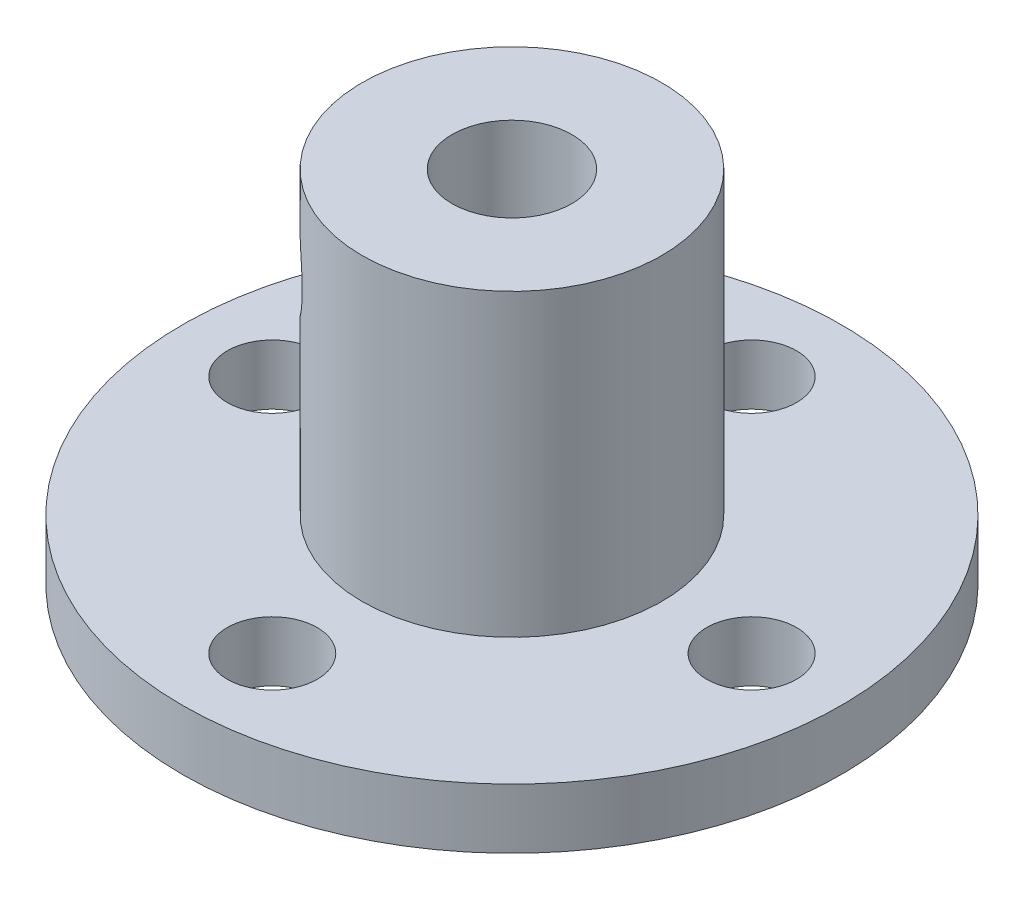
ISO-10303-21;
HEADER;
FILE_DESCRIPTION(('STEP AP214'),'2;1');
FILE_NAME('part.step','',(''),(''),'','','');
FILE_SCHEMA(('AUTOMOTIVE_DESIGN { 1 0 10303 214 1 1 1 1 }'));
ENDSEC;
DATA;
#1=APPLICATION_CONTEXT('core data for automotive mechanical design processes');
#2=APPLICATION_PROTOCOL_DEFINITION('international standard','automotive_design',2000,#1);
#3=PRODUCT_CONTEXT('',#1,'mechanical');
#4=PRODUCT('Part','Part','',(#3));
#5=PRODUCT_RELATED_PRODUCT_CATEGORY('part','',(#4));
#6=PRODUCT_DEFINITION_FORMATION('','',#4);
#7=PRODUCT_DEFINITION_CONTEXT('part definition',#1,'design');
#8=PRODUCT_DEFINITION('design','',#6,#7);
#9=PRODUCT_DEFINITION_SHAPE('','',#8);
#10=(LENGTH_UNIT() NAMED_UNIT(*) SI_UNIT(.MILLI.,.METRE.));
#11=(NAMED_UNIT(*) PLANE_ANGLE_UNIT() SI_UNIT($,.RADIAN.));
#12=(NAMED_UNIT(*) SI_UNIT($,.STERADIAN.) SOLID_ANGLE_UNIT());
#13=UNCERTAINTY_MEASURE_WITH_UNIT(LENGTH_MEASURE(1.E-05),#10,'distance_accuracy_value','');
#14=(GEOMETRIC_REPRESENTATION_CONTEXT(3) GLOBAL_UNCERTAINTY_ASSIGNED_CONTEXT((#13)) GLOBAL_UNIT_ASSIGNED_CONTEXT((#10,
#11,#12)) REPRESENTATION_CONTEXT('',''));
#15=CARTESIAN_POINT('',(0.,0.,0.));
#16=DIRECTION('',(0.,0.,1.));
#17=DIRECTION('',(1.,0.,0.));
#18=AXIS2_PLACEMENT_3D('',#15,#16,#17);
#19=CARTESIAN_POINT('',(8.00000000000023,2.,-2.25904099284255E-13));
#20=DIRECTION('',(0.,-1.,0.));
#21=DIRECTION('',(0.,0.,-1.));
#22=AXIS2_PLACEMENT_3D('',#19,#20,#21);
#23=CYLINDRICAL_SURFACE('',#22,1.50000000000018);
#24=CARTESIAN_POINT('',(8.00000000000023,2.,-2.25904099284255E-13));
#25=DIRECTION('',(0.,1.,0.));
#26=DIRECTION('',(0.,0.,1.));
#27=AXIS2_PLACEMENT_3D('',#24,#25,#26);
#28=CIRCLE('',#27,1.50000000000018);
#29=CARTESIAN_POINT('',(8.00000000000023,2.,1.49999999999995));
#30=VERTEX_POINT('',#29);
#31=EDGE_CURVE('E54',#30,#30,#28,.T.);
#32=ORIENTED_EDGE('',*,*,#31,.T.);
#33=EDGE_LOOP('',(#32));
#34=FACE_BOUND('',#33,.T.);
#35=CARTESIAN_POINT('',(8.00000000000023,0.,-2.25904099284255E-13));
#36=DIRECTION('',(0.,1.,0.));
#37=DIRECTION('',(0.,0.,1.));
#38=AXIS2_PLACEMENT_3D('',#35,#36,#37);
#39=CIRCLE('',#38,1.50000000000018);
#40=CARTESIAN_POINT('',(8.00000000000023,0.,1.49999999999995));
#41=VERTEX_POINT('',#40);
#42=EDGE_CURVE('E70',#41,#41,#39,.T.);
#43=ORIENTED_EDGE('',*,*,#42,.F.);
#44=EDGE_LOOP('',(#43));
#45=FACE_BOUND('',#44,.T.);
#46=ADVANCED_FACE('F39',(#34,#45),#23,.F.);
#47=CARTESIAN_POINT('',(4.51808198568511E-13,2.,8.));
#48=DIRECTION('',(0.,-1.,0.));
#49=DIRECTION('',(0.,0.,-1.));
#50=AXIS2_PLACEMENT_3D('',#47,#48,#49);
#51=CYLINDRICAL_SURFACE('',#50,1.50000000000049);
#52=CARTESIAN_POINT('',(4.51808198568511E-13,2.,8.));
#53=DIRECTION('',(0.,1.,0.));
#54=DIRECTION('',(0.,0.,1.));
#55=AXIS2_PLACEMENT_3D('',#52,#53,#54);
#56=CIRCLE('',#55,1.50000000000049);
#57=CARTESIAN_POINT('',(4.51808198568511E-13,2.,9.50000000000048));
#58=VERTEX_POINT('',#57);
#59=EDGE_CURVE('E88',#58,#58,#56,.T.);
#60=ORIENTED_EDGE('',*,*,#59,.T.);
#61=EDGE_LOOP('',(#60));
#62=FACE_BOUND('',#61,.T.);
#63=CARTESIAN_POINT('',(4.51808198568511E-13,0.,8.));
#64=DIRECTION('',(0.,1.,0.));
#65=DIRECTION('',(0.,0.,1.));
#66=AXIS2_PLACEMENT_3D('',#63,#64,#65);
#67=CIRCLE('',#66,1.50000000000049);
#68=CARTESIAN_POINT('',(4.51808198568511E-13,0.,9.50000000000048));
#69=VERTEX_POINT('',#68);
#70=EDGE_CURVE('E67',#69,#69,#67,.T.);
#71=ORIENTED_EDGE('',*,*,#70,.F.);
#72=EDGE_LOOP('',(#71));
#73=FACE_BOUND('',#72,.T.);
#74=ADVANCED_FACE('F159',(#62,#73),#51,.F.);
#75=CARTESIAN_POINT('',(-7.99999999999977,2.,2.26883816723573E-13));
#76=DIRECTION('',(0.,-1.,0.));
#77=DIRECTION('',(0.,0.,-1.));
#78=AXIS2_PLACEMENT_3D('',#75,#76,#77);
#79=CYLINDRICAL_SURFACE('',#78,1.50000000000036);
#80=CARTESIAN_POINT('',(-7.99999999999977,2.,2.26883816723573E-13));
#81=DIRECTION('',(0.,1.,0.));
#82=DIRECTION('',(0.,0.,1.));
#83=AXIS2_PLACEMENT_3D('',#80,#81,#82);
#84=CIRCLE('',#83,1.50000000000036);
#85=CARTESIAN_POINT('',(-7.99999999999977,2.,1.50000000000059));
#86=VERTEX_POINT('',#85);
#87=EDGE_CURVE('E82',#86,#86,#84,.T.);
#88=ORIENTED_EDGE('',*,*,#87,.T.);
#89=EDGE_LOOP('',(#88));
#90=FACE_BOUND('',#89,.T.);
#91=CARTESIAN_POINT('',(-7.99999999999977,0.,2.26883816723573E-13));
#92=DIRECTION('',(0.,1.,0.));
#93=DIRECTION('',(0.,0.,1.));
#94=AXIS2_PLACEMENT_3D('',#91,#92,#93);
#95=CIRCLE('',#94,1.50000000000036);
#96=CARTESIAN_POINT('',(-7.99999999999977,0.,1.50000000000059));
#97=VERTEX_POINT('',#96);
#98=EDGE_CURVE('E62',#97,#97,#95,.T.);
#99=ORIENTED_EDGE('',*,*,#98,.F.);
#100=EDGE_LOOP('',(#99));
#101=FACE_BOUND('',#100,.T.);
#102=ADVANCED_FACE('F164',(#90,#101),#79,.F.);
#103=CARTESIAN_POINT('',(0.,2.,-8.));
#104=DIRECTION('',(0.,-1.,0.));
#105=DIRECTION('',(0.,0.,-1.));
#106=AXIS2_PLACEMENT_3D('',#103,#104,#105);
#107=CYLINDRICAL_SURFACE('',#106,1.5);
#108=CARTESIAN_POINT('',(0.,2.,-8.));
#109=DIRECTION('',(0.,1.,0.));
#110=DIRECTION('',(0.,0.,1.));
#111=AXIS2_PLACEMENT_3D('',#108,#109,#110);
#112=CIRCLE('',#111,1.5);
#113=CARTESIAN_POINT('',(0.,2.,-6.5));
#114=VERTEX_POINT('',#113);
#115=EDGE_CURVE('E77',#114,#114,#112,.T.);
#116=ORIENTED_EDGE('',*,*,#115,.T.);
#117=EDGE_LOOP('',(#116));
#118=FACE_BOUND('',#117,.T.);
#119=CARTESIAN_POINT('',(0.,0.,-8.));
#120=DIRECTION('',(0.,1.,0.));
#121=DIRECTION('',(0.,0.,1.));
#122=AXIS2_PLACEMENT_3D('',#119,#120,#121);
#123=CIRCLE('',#122,1.5);
#124=CARTESIAN_POINT('',(0.,0.,-6.5));
#125=VERTEX_POINT('',#124);
#126=EDGE_CURVE('E58',#125,#125,#123,.T.);
#127=ORIENTED_EDGE('',*,*,#126,.F.);
#128=EDGE_LOOP('',(#127));
#129=FACE_BOUND('',#128,.T.);
#130=ADVANCED_FACE('F41',(#118,#129),#107,.F.);
#131=CARTESIAN_POINT('',(0.,2.,0.));
#132=DIRECTION('',(0.,-1.,0.));
#133=DIRECTION('',(0.,0.,-1.));
#134=AXIS2_PLACEMENT_3D('',#131,#132,#133);
#135=CYLINDRICAL_SURFACE('',#134,11.);
#136=CARTESIAN_POINT('',(0.,2.,0.));
#137=DIRECTION('',(0.,1.,0.));
#138=DIRECTION('',(0.,0.,1.));
#139=AXIS2_PLACEMENT_3D('',#136,#137,#138);
#140=CIRCLE('',#139,11.);
#141=CARTESIAN_POINT('',(0.,2.,11.));
#142=VERTEX_POINT('',#141);
#143=EDGE_CURVE('E10',#142,#142,#140,.T.);
#144=ORIENTED_EDGE('',*,*,#143,.F.);
#145=EDGE_LOOP('',(#144));
#146=FACE_BOUND('',#145,.T.);
#147=CARTESIAN_POINT('',(0.,0.,0.));
#148=DIRECTION('',(0.,1.,0.));
#149=DIRECTION('',(0.,0.,1.));
#150=AXIS2_PLACEMENT_3D('',#147,#148,#149);
#151=CIRCLE('',#150,11.);
#152=CARTESIAN_POINT('',(0.,0.,11.));
#153=VERTEX_POINT('',#152);
#154=EDGE_CURVE('E43',#153,#153,#151,.T.);
#155=ORIENTED_EDGE('',*,*,#154,.T.);
#156=EDGE_LOOP('',(#155));
#157=FACE_BOUND('',#156,.T.);
#158=ADVANCED_FACE('F106',(#146,#157),#135,.T.);
#159=CARTESIAN_POINT('',(0.,2.,0.));
#160=DIRECTION('',(0.,1.,0.));
#161=DIRECTION('',(0.,0.,1.));
#162=AXIS2_PLACEMENT_3D('',#159,#160,#161);
#163=PLANE('',#162);
#164=ORIENTED_EDGE('',*,*,#115,.F.);
#165=EDGE_LOOP('',(#164));
#166=FACE_BOUND('',#165,.T.);
#167=ORIENTED_EDGE('',*,*,#87,.F.);
#168=EDGE_LOOP('',(#167));
#169=FACE_BOUND('',#168,.T.);
#170=ORIENTED_EDGE('',*,*,#59,.F.);
#171=EDGE_LOOP('',(#170));
#172=FACE_BOUND('',#171,.T.);
#173=ORIENTED_EDGE('',*,*,#31,.F.);
#174=EDGE_LOOP('',(#173));
#175=FACE_BOUND('',#174,.T.);
#176=CARTESIAN_POINT('',(0.,2.,0.));
#177=DIRECTION('',(0.,1.,0.));
#178=DIRECTION('',(0.,0.,1.));
#179=AXIS2_PLACEMENT_3D('',#176,#177,#178);
#180=CIRCLE('',#179,5.);
#181=CARTESIAN_POINT('',(0.,2.,5.));
#182=VERTEX_POINT('',#181);
#183=EDGE_CURVE('E48',#182,#182,#180,.T.);
#184=ORIENTED_EDGE('',*,*,#183,.F.);
#185=EDGE_LOOP('',(#184));
#186=FACE_BOUND('',#185,.T.);
#187=ORIENTED_EDGE('',*,*,#143,.T.);
#188=EDGE_LOOP('',(#187));
#189=FACE_BOUND('',#188,.T.);
#190=ADVANCED_FACE('F102',(#166,#169,#172,#175,#186,#189),#163,.T.);
#191=CARTESIAN_POINT('',(0.,0.,0.));
#192=DIRECTION('',(0.,1.,0.));
#193=DIRECTION('',(0.,0.,1.));
#194=AXIS2_PLACEMENT_3D('',#191,#192,#193);
#195=PLANE('',#194);
#196=ORIENTED_EDGE('',*,*,#126,.T.);
#197=EDGE_LOOP('',(#196));
#198=FACE_BOUND('',#197,.T.);
#199=ORIENTED_EDGE('',*,*,#98,.T.);
#200=EDGE_LOOP('',(#199));
#201=FACE_BOUND('',#200,.T.);
#202=ORIENTED_EDGE('',*,*,#70,.T.);
#203=EDGE_LOOP('',(#202));
#204=FACE_BOUND('',#203,.T.);
#205=ORIENTED_EDGE('',*,*,#42,.T.);
#206=EDGE_LOOP('',(#205));
#207=FACE_BOUND('',#206,.T.);
#208=ORIENTED_EDGE('',*,*,#154,.F.);
#209=EDGE_LOOP('',(#208));
#210=FACE_BOUND('',#209,.T.);
#211=CARTESIAN_POINT('',(0.,0.,0.));
#212=DIRECTION('',(0.,1.,0.));
#213=DIRECTION('',(0.,0.,1.));
#214=AXIS2_PLACEMENT_3D('',#211,#212,#213);
#215=CIRCLE('',#214,2.);
#216=CARTESIAN_POINT('',(0.,0.,2.));
#217=VERTEX_POINT('',#216);
#218=EDGE_CURVE('E91',#217,#217,#215,.T.);
#219=ORIENTED_EDGE('',*,*,#218,.T.);
#220=EDGE_LOOP('',(#219));
#221=FACE_BOUND('',#220,.T.);
#222=ADVANCED_FACE('F105',(#198,#201,#204,#207,#210,#221),#195,.F.);
#223=CARTESIAN_POINT('',(0.,12.,0.));
#224=DIRECTION('',(0.,-1.,0.));
#225=DIRECTION('',(0.,0.,-1.));
#226=AXIS2_PLACEMENT_3D('',#223,#224,#225);
#227=CYLINDRICAL_SURFACE('',#226,5.);
#228=CARTESIAN_POINT('',(-3.00093621952962,9.,3.99929766412995));
#229=CARTESIAN_POINT('',(-3.00093750706042,8.9178054520576,3.99929732802918));
#230=CARTESIAN_POINT('',(-3.00663323052325,8.83560077585598,3.9950419324184));
#231=CARTESIAN_POINT('',(-3.02905463375854,8.67359475040806,3.97806737331185));
#232=CARTESIAN_POINT('',(-3.04578399894251,8.59379421349854,3.96534538182578));
#233=CARTESIAN_POINT('',(-3.08922086279584,8.43896527172827,3.93159803763022));
#234=CARTESIAN_POINT('',(-3.11591176355203,8.36392917036692,3.91058649366926));
#235=CARTESIAN_POINT('',(-3.17782172064971,8.2203780660047,3.86044425065389));
#236=CARTESIAN_POINT('',(-3.21304205360707,8.15186404131556,3.83131233610997));
#237=CARTESIAN_POINT('',(-3.29142296740279,8.02113360942263,3.76420848489704));
#238=CARTESIAN_POINT('',(-3.3347822629289,7.95915410205371,3.72600702876748));
#239=CARTESIAN_POINT('',(-3.42675312763869,7.84536204867749,3.64160039570079));
#240=CARTESIAN_POINT('',(-3.47536537071577,7.79355080955012,3.59539419138579));
#241=CARTESIAN_POINT('',(-3.57683966667212,7.7005373001667,3.49448633752821));
#242=CARTESIAN_POINT('',(-3.62976881501523,7.65957657555719,3.43962876569954));
#243=CARTESIAN_POINT('',(-3.73675536743129,7.59101274095725,3.32308677435373));
#244=CARTESIAN_POINT('',(-3.79081252554809,7.56340675014255,3.26140383070642));
#245=CARTESIAN_POINT('',(-3.89637150278916,7.52311999890949,3.13447042925031));
#246=CARTESIAN_POINT('',(-3.94790218458889,7.5100348723473,3.06937250180244));
#247=CARTESIAN_POINT('',(-4.04819357555304,7.49788267535356,2.93582962611109));
#248=CARTESIAN_POINT('',(-4.09695486435678,7.49881266059804,2.86738538387991));
#249=CARTESIAN_POINT('',(-4.1887533775121,7.51439286854303,2.73145784664244));
#250=CARTESIAN_POINT('',(-4.23192344201782,7.52860519380987,2.66401336808339));
#251=CARTESIAN_POINT('',(-4.31337071948706,7.56963133599429,2.53001663708175));
#252=CARTESIAN_POINT('',(-4.3516476223994,7.59644595094267,2.46346444141687));
#253=CARTESIAN_POINT('',(-4.42320739163136,7.66221202341856,2.33256728850326));
#254=CARTESIAN_POINT('',(-4.45642689926375,7.70130120280727,2.26825706743813));
#255=CARTESIAN_POINT('',(-4.51718456523303,7.79039785242823,2.14471214708871));
#256=CARTESIAN_POINT('',(-4.54472137268206,7.84040791296349,2.08547865659374));
#257=CARTESIAN_POINT('',(-4.59518262413587,7.9521977507516,1.97188018838453));
#258=CARTESIAN_POINT('',(-4.61788834878027,8.01435691902974,1.91779090519163));
#259=CARTESIAN_POINT('',(-4.65759993513567,8.14751001789005,1.81922890971336));
#260=CARTESIAN_POINT('',(-4.6746052304725,8.21850482538923,1.77475715314657));
#261=CARTESIAN_POINT('',(-4.70341565394048,8.36823946924899,1.69694626114274));
#262=CARTESIAN_POINT('',(-4.71516935312555,8.44704704586292,1.66371796754416));
#263=CARTESIAN_POINT('',(-4.73356288937106,8.60960720844554,1.61064594463425));
#264=CARTESIAN_POINT('',(-4.7402043947861,8.69335817153456,1.59079784898392));
#265=CARTESIAN_POINT('',(-4.748439764523,8.86008236073928,1.56604110379328));
#266=CARTESIAN_POINT('',(-4.75021254127097,8.94296822389398,1.56060319494846));
#267=CARTESIAN_POINT('',(-4.74928261085414,9.10847290000987,1.56343135264486));
#268=CARTESIAN_POINT('',(-4.74658053017336,9.19109174873085,1.57169550088605));
#269=CARTESIAN_POINT('',(-4.73674528573022,9.35148837797087,1.60108435277385));
#270=CARTESIAN_POINT('',(-4.72972905924159,9.42933616426352,1.62186937884184));
#271=CARTESIAN_POINT('',(-4.71117121120473,9.58040169081492,1.67500824855607));
#272=CARTESIAN_POINT('',(-4.6996288909102,9.65361871414057,1.7073638784245));
#273=CARTESIAN_POINT('',(-4.67136326337126,9.79551746407213,1.78326742005314));
#274=CARTESIAN_POINT('',(-4.65450921452282,9.86402472098579,1.82709242171581));
#275=CARTESIAN_POINT('',(-4.61539881980203,9.9926381061808,1.92374815518491));
#276=CARTESIAN_POINT('',(-4.59314118050299,10.0527422176128,1.97658104225483));
#277=CARTESIAN_POINT('',(-4.54199205605493,10.1651804058147,2.09150764946446));
#278=CARTESIAN_POINT('',(-4.51288190897507,10.217135628987,2.15387562562397));
#279=CARTESIAN_POINT('',(-4.44841352058553,10.3089667010278,2.28405004137965));
#280=CARTESIAN_POINT('',(-4.41305558970648,10.3488431497815,2.35185621067958));
#281=CARTESIAN_POINT('',(-4.33659381321852,10.4150000305683,2.49000663229833));
#282=CARTESIAN_POINT('',(-4.2955359338869,10.441382016159,2.56032753376265));
#283=CARTESIAN_POINT('',(-4.20814415533143,10.4800609188904,2.70155662944123));
#284=CARTESIAN_POINT('',(-4.16181176981844,10.4923618659484,2.77246464977074));
#285=CARTESIAN_POINT('',(-4.06691861821062,10.5022230440545,2.90978900522951));
#286=CARTESIAN_POINT('',(-4.01851237802146,10.5003326954078,2.97627315728521));
#287=CARTESIAN_POINT('',(-3.91936767300579,10.4831783675009,3.1056722794747));
#288=CARTESIAN_POINT('',(-3.86862934056994,10.4679151465196,3.16858745176417));
#289=CARTESIAN_POINT('',(-3.76710113458815,10.4247883386004,3.28862717094456));
#290=CARTESIAN_POINT('',(-3.71631766530078,10.397061819351,3.34580664488966));
#291=CARTESIAN_POINT('',(-3.61595819020899,10.3299180854928,3.45402649878662));
#292=CARTESIAN_POINT('',(-3.5663823842809,10.2904989497138,3.50506586794222));
#293=CARTESIAN_POINT('',(-3.46873431429017,10.19962654257,3.60177154327404));
#294=CARTESIAN_POINT('',(-3.42076091644025,10.1478285699992,3.64721367068084));
#295=CARTESIAN_POINT('',(-3.3300331198177,10.0342896116672,3.73023710072368));
#296=CARTESIAN_POINT('',(-3.28728023048426,9.97254576210185,3.76781613208276));
#297=CARTESIAN_POINT('',(-3.20775785763799,9.8386592216895,3.8357674270642));
#298=CARTESIAN_POINT('',(-3.17120468369908,9.76626144660957,3.86589151546601));
#299=CARTESIAN_POINT('',(-3.10766200969903,9.61444482583898,3.91715628445722));
#300=CARTESIAN_POINT('',(-3.08066791478899,9.53502937639881,3.93830128208346));
#301=CARTESIAN_POINT('',(-3.04017207635897,9.38025956839373,3.96962678062164));
#302=CARTESIAN_POINT('',(-3.02552893238426,9.30539135306901,3.98074404847888));
#303=CARTESIAN_POINT('',(-3.0059113712457,9.15368477750423,3.99557890563192));
#304=CARTESIAN_POINT('',(-3.00093501576801,9.07684681535475,3.99929797836336));
#305=CARTESIAN_POINT('',(-3.00093621952962,9.,3.99929766412995));
#306=B_SPLINE_CURVE_WITH_KNOTS('',3,(#228,#229,#230,#231,#232,#233,#234,#235,#236,#237,#238,
#239,#240,#241,#242,#243,#244,#245,#246,#247,#248,#249,#250,#251,#252,#253,#254,#255,#256,#257,
#258,#259,#260,#261,#262,#263,#264,#265,#266,#267,#268,#269,#270,#271,#272,#273,#274,#275,#276,
#277,#278,#279,#280,#281,#282,#283,#284,#285,#286,#287,#288,#289,#290,#291,#292,#293,#294,#295,
#296,#297,#298,#299,#300,#301,#302,#303,#304,#305),.UNSPECIFIED.,.T.,.F.,(4,2,2,2,2,2,2,2,2,2,2,
2,2,2,2,2,2,2,2,2,2,2,2,2,2,2,2,2,2,2,2,2,2,2,2,2,2,2,4),(0.,0.246300165915542,
0.492682641688999,0.738656414466193,0.9846670253701,1.23773150007984,1.49082847871273,
1.74915939273644,2.00743455587877,2.25832140149557,2.5091555410144,2.7520012599088,
2.99486235890376,3.24055209335676,3.4863001659083,3.74152147023278,3.99676812491863,
4.25446238246266,4.51207250628411,4.76008080790309,5.00805439107387,5.24958594938817,
5.49115481045787,5.73920731809388,5.98731925928923,6.24479506100602,6.50225807324202,
6.75775391814325,7.01317662321682,7.2587630391122,7.50433553047754,7.74727096872219,
7.99024634491378,8.24099627054488,8.4918185262989,8.75011639669147,9.00828993963944,
9.23861153857447,9.4688869503356),.UNSPECIFIED.);
#307=CARTESIAN_POINT('',(-3.00093621952962,9.,3.99929766412995));
#308=VERTEX_POINT('',#307);
#309=EDGE_CURVE('E127',#308,#308,#306,.T.);
#310=ORIENTED_EDGE('',*,*,#309,.T.);
#311=EDGE_LOOP('',(#310));
#312=FACE_BOUND('',#311,.T.);
#313=ORIENTED_EDGE('',*,*,#183,.T.);
#314=EDGE_LOOP('',(#313));
#315=FACE_BOUND('',#314,.T.);
#316=CARTESIAN_POINT('',(0.,12.,0.));
#317=DIRECTION('',(0.,1.,0.));
#318=DIRECTION('',(0.,0.,1.));
#319=AXIS2_PLACEMENT_3D('',#316,#317,#318);
#320=CIRCLE('',#319,5.);
#321=CARTESIAN_POINT('',(0.,12.,5.));
#322=VERTEX_POINT('',#321);
#323=EDGE_CURVE('E119',#322,#322,#320,.T.);
#324=ORIENTED_EDGE('',*,*,#323,.F.);
#325=EDGE_LOOP('',(#324));
#326=FACE_BOUND('',#325,.T.);
#327=ADVANCED_FACE('F111',(#312,#315,#326),#227,.T.);
#328=CARTESIAN_POINT('',(0.,12.,0.));
#329=DIRECTION('',(0.,-1.,0.));
#330=DIRECTION('',(0.,0.,-1.));
#331=AXIS2_PLACEMENT_3D('',#328,#329,#330);
#332=CYLINDRICAL_SURFACE('',#331,2.);
#333=CARTESIAN_POINT('',(-0.200394683893089,9.,1.9899351674533));
#334=CARTESIAN_POINT('',(-0.200412435520012,9.06999742342563,1.98993829238135));
#335=CARTESIAN_POINT('',(-0.207907044168279,9.14004583431192,1.98922194312847));
#336=CARTESIAN_POINT('',(-0.236474574093858,9.27732985620948,1.98601702328113));
#337=CARTESIAN_POINT('',(-0.257587967590081,9.34455644501951,1.98352316797842));
#338=CARTESIAN_POINT('',(-0.309922429814608,9.47357984673838,1.97601370912527));
#339=CARTESIAN_POINT('',(-0.341000025168061,9.53543877676246,1.97103337254202));
#340=CARTESIAN_POINT('',(-0.410568169835815,9.65434545444519,1.95772536885289));
#341=CARTESIAN_POINT('',(-0.449057823092276,9.71139378246922,1.94939810623114));
#342=CARTESIAN_POINT('',(-0.540006520577149,9.83211279631659,1.9264023906407));
#343=CARTESIAN_POINT('',(-0.59370294818083,9.89466793422648,1.9107710980519));
#344=CARTESIAN_POINT('',(-0.706284641597885,10.0125254662423,1.87208923484964));
#345=CARTESIAN_POINT('',(-0.765177485805969,10.0678169648203,1.84902769371132));
#346=CARTESIAN_POINT('',(-0.898331817622574,10.1808587386555,1.78868034265028));
#347=CARTESIAN_POINT('',(-0.973276060298701,10.2368059667199,1.74945164338269));
#348=CARTESIAN_POINT('',(-1.12361104999837,10.3346222082828,1.65687550836325));
#349=CARTESIAN_POINT('',(-1.19900031642601,10.3765242974688,1.60356177980422));
#350=CARTESIAN_POINT('',(-1.32356309474387,10.4332076859029,1.50086762069931));
#351=CARTESIAN_POINT('',(-1.3737856578717,10.4523570959785,1.45515048951878));
#352=CARTESIAN_POINT('',(-1.4705231504571,10.4813901159967,1.35730527536289));
#353=CARTESIAN_POINT('',(-1.51704126888171,10.4912817761067,1.30518280691988));
#354=CARTESIAN_POINT('',(-1.60483446946832,10.5012217338625,1.19559545354949));
#355=CARTESIAN_POINT('',(-1.64609565099041,10.5012444543764,1.13811707296365));
#356=CARTESIAN_POINT('',(-1.72195544330184,10.4913820632197,1.01971327887834));
#357=CARTESIAN_POINT('',(-1.75655250896012,10.4814946570919,0.958787070197447));
#358=CARTESIAN_POINT('',(-1.81737014139987,10.4529189494101,0.837621006762848));
#359=CARTESIAN_POINT('',(-1.84383701655671,10.4345436736129,0.77742911336595));
#360=CARTESIAN_POINT('',(-1.88997920565513,10.3900043578178,0.657358822527393));
#361=CARTESIAN_POINT('',(-1.90965303668069,10.3638386194868,0.597480496343239));
#362=CARTESIAN_POINT('',(-1.94444788757544,10.3014703848547,0.473010134350433));
#363=CARTESIAN_POINT('',(-1.95884528879914,10.2644879033812,0.408609719966667));
#364=CARTESIAN_POINT('',(-1.9808550330514,10.1832662960295,0.283316133362628));
#365=CARTESIAN_POINT('',(-1.98846155821943,10.1390209863001,0.222426010158942));
#366=CARTESIAN_POINT('',(-1.99902941230158,10.0347766511791,0.0938763370365585));
#367=CARTESIAN_POINT('',(-2.00078259092245,9.97339078997361,0.0272414421220826));
#368=CARTESIAN_POINT('',(-1.99860723658629,9.84216541637806,-0.0971056011624595));
#369=CARTESIAN_POINT('',(-1.99467600314873,9.77232190047494,-0.154813494182309));
#370=CARTESIAN_POINT('',(-1.98499589834288,9.63901812975437,-0.248069527937502));
#371=CARTESIAN_POINT('',(-1.97975799140544,9.57701295469935,-0.285743498436778));
#372=CARTESIAN_POINT('',(-1.96923248677491,9.44793471858062,-0.351025053046238));
#373=CARTESIAN_POINT('',(-1.96394502940866,9.38087352030963,-0.37865536619993));
#374=CARTESIAN_POINT('',(-1.95616391817791,9.25631305600168,-0.416807638560631));
#375=CARTESIAN_POINT('',(-1.95332424412482,9.19955291788314,-0.429635036993427));
#376=CARTESIAN_POINT('',(-1.94973335647052,9.08464453382618,-0.445659971608953));
#377=CARTESIAN_POINT('',(-1.94897947098699,9.02649816009718,-0.448869828241553));
#378=CARTESIAN_POINT('',(-1.9498005799729,8.91052100826661,-0.445285702396194));
#379=CARTESIAN_POINT('',(-1.95137643164831,8.85269035419033,-0.438488037744051));
#380=CARTESIAN_POINT('',(-1.95635786782922,8.73892384755713,-0.415685612829321));
#381=CARTESIAN_POINT('',(-1.95976657468542,8.6829914020519,-0.399665137796968));
#382=CARTESIAN_POINT('',(-1.96889826255257,8.55366195506113,-0.352428701399085));
#383=CARTESIAN_POINT('',(-1.97500991572737,8.48156404608498,-0.317769557344814));
#384=CARTESIAN_POINT('',(-1.98626085218446,8.34369233635989,-0.237508660578156));
#385=CARTESIAN_POINT('',(-1.99139831555377,8.27793048270526,-0.191886781448145));
#386=CARTESIAN_POINT('',(-1.99861750455646,8.15065099195188,-0.0905616008874626));
#387=CARTESIAN_POINT('',(-2.00058419149982,8.08936712378175,-0.0345577329169885));
#388=CARTESIAN_POINT('',(-1.99910526334961,7.97399790363876,0.084400191688424));
#389=CARTESIAN_POINT('',(-1.99565701189918,7.91991607201107,0.147357619909354));
#390=CARTESIAN_POINT('',(-1.98005597206694,7.80872300837064,0.292998490501852));
#391=CARTESIAN_POINT('',(-1.96616834536838,7.75352476114241,0.376989008021766));
#392=CARTESIAN_POINT('',(-1.92500184882512,7.65737926654913,0.549722778420434));
#393=CARTESIAN_POINT('',(-1.89775227524919,7.61640117541871,0.638455256962347));
#394=CARTESIAN_POINT('',(-1.83889651039726,7.56156200855314,0.78923032368647));
#395=CARTESIAN_POINT('',(-1.81114440616607,7.54324320672456,0.851171498380763));
#396=CARTESIAN_POINT('',(-1.74846102834786,7.51587120369248,0.973440563963186));
#397=CARTESIAN_POINT('',(-1.71353620704429,7.50680971845149,1.03376985010001));
#398=CARTESIAN_POINT('',(-1.63708504073657,7.4984836090714,1.15102700169554));
#399=CARTESIAN_POINT('',(-1.59554342405932,7.49924198265176,1.20794656871192));
#400=CARTESIAN_POINT('',(-1.507220685829,7.51056099130124,1.31650483306631));
#401=CARTESIAN_POINT('',(-1.46043817138356,7.52112423770748,1.36814211950401));
#402=CARTESIAN_POINT('',(-1.36474461652808,7.55097491616724,1.46352625485357));
#403=CARTESIAN_POINT('',(-1.3159347936524,7.57000018132155,1.50745864720957));
#404=CARTESIAN_POINT('',(-1.21654861544824,7.61578806561894,1.58875319710397));
#405=CARTESIAN_POINT('',(-1.16597188428406,7.64255233983091,1.62611394647538));
#406=CARTESIAN_POINT('',(-1.05873262843294,7.70627793759597,1.69815105550257));
#407=CARTESIAN_POINT('',(-1.00202972018336,7.74405093135959,1.73204390846329));
#408=CARTESIAN_POINT('',(-0.889905781932134,7.82686644055421,1.79224042593856));
#409=CARTESIAN_POINT('',(-0.834485984125903,7.87191563728605,1.81853705281258));
#410=CARTESIAN_POINT('',(-0.715826672929671,7.97800536656079,1.86882827849485));
#411=CARTESIAN_POINT('',(-0.653209043850891,8.0404463994399,1.89133838458614));
#412=CARTESIAN_POINT('',(-0.534939888441043,8.17386807189987,1.92812520452311));
#413=CARTESIAN_POINT('',(-0.479290917965149,8.24485182603656,1.94239890443371));
#414=CARTESIAN_POINT('',(-0.389768549676352,8.3788832505903,1.96206726261805));
#415=CARTESIAN_POINT('',(-0.353787818838449,8.44033498270655,1.96871363882688));
#416=CARTESIAN_POINT('',(-0.291309926983283,8.56808291305588,1.97892475349804));
#417=CARTESIAN_POINT('',(-0.264787617130124,8.63436569159545,1.98249770015922));
#418=CARTESIAN_POINT('',(-0.230310529716908,8.75078821959693,1.98674791166201));
#419=CARTESIAN_POINT('',(-0.219192313008436,8.79996707129046,1.98796689486536));
#420=CARTESIAN_POINT('',(-0.204230398406643,8.89942233303365,1.98955912243784));
#421=CARTESIAN_POINT('',(-0.200381927104667,8.94969800094373,1.98993292179738));
#422=CARTESIAN_POINT('',(-0.200394683893089,9.,1.9899351674533));
#423=B_SPLINE_CURVE_WITH_KNOTS('',3,(#333,#334,#335,#336,#337,#338,#339,#340,#341,#342,#343,
#344,#345,#346,#347,#348,#349,#350,#351,#352,#353,#354,#355,#356,#357,#358,#359,#360,#361,#362,
#363,#364,#365,#366,#367,#368,#369,#370,#371,#372,#373,#374,#375,#376,#377,#378,#379,#380,#381,
#382,#383,#384,#385,#386,#387,#388,#389,#390,#391,#392,#393,#394,#395,#396,#397,#398,#399,#400,
#401,#402,#403,#404,#405,#406,#407,#408,#409,#410,#411,#412,#413,#414,#415,#416,#417,#418,#419,
#420,#421,#422),.UNSPECIFIED.,.T.,.F.,(4,2,2,2,2,2,2,2,2,2,2,2,2,2,2,2,2,2,2,2,2,2,2,2,2,2,2,2,
2,2,2,2,2,2,2,2,2,2,2,2,2,2,2,2,4),(0.,0.20973177668449,0.420089722582993,0.627545385620136,
0.834975984672343,1.08585208691169,1.33710031031849,1.63964848103538,1.94147907444963,
2.15227725277555,2.36289195870711,2.57405250727806,2.78526195641288,2.9892375589505,
3.19325766108669,3.41936844116894,3.64567274887663,3.91649517204701,4.18744629647932,
4.40499409477196,4.62204646613006,4.79608005545901,4.96989060538192,5.14376512326213,
5.31793678696019,5.55730028202397,5.7971066263915,6.04543209090059,6.29387849446617,
6.59652499511462,6.89851088586564,7.10852896194426,7.3183589353918,7.52868041101043,
7.73905791773944,7.94332812691912,8.14764205379332,8.37510052489609,8.60276905744644,
8.87547580578154,9.1482822820853,9.36218279640834,9.57551025772698,9.72632812073766,
9.87704692032409),.UNSPECIFIED.);
#424=CARTESIAN_POINT('',(-0.200394683893089,9.,1.9899351674533));
#425=VERTEX_POINT('',#424);
#426=EDGE_CURVE('E136',#425,#425,#423,.T.);
#427=ORIENTED_EDGE('',*,*,#426,.T.);
#428=EDGE_LOOP('',(#427));
#429=FACE_BOUND('',#428,.T.);
#430=CARTESIAN_POINT('',(0.,12.,0.));
#431=DIRECTION('',(0.,1.,0.));
#432=DIRECTION('',(0.,0.,1.));
#433=AXIS2_PLACEMENT_3D('',#430,#431,#432);
#434=CIRCLE('',#433,2.);
#435=CARTESIAN_POINT('',(0.,12.,2.));
#436=VERTEX_POINT('',#435);
#437=EDGE_CURVE('E63',#436,#436,#434,.T.);
#438=ORIENTED_EDGE('',*,*,#437,.T.);
#439=EDGE_LOOP('',(#438));
#440=FACE_BOUND('',#439,.T.);
#441=ORIENTED_EDGE('',*,*,#218,.F.);
#442=EDGE_LOOP('',(#441));
#443=FACE_BOUND('',#442,.T.);
#444=ADVANCED_FACE('F114',(#429,#440,#443),#332,.F.);
#445=CARTESIAN_POINT('',(0.,12.,0.));
#446=DIRECTION('',(0.,1.,0.));
#447=DIRECTION('',(0.,0.,1.));
#448=AXIS2_PLACEMENT_3D('',#445,#446,#447);
#449=PLANE('',#448);
#450=ORIENTED_EDGE('',*,*,#323,.T.);
#451=EDGE_LOOP('',(#450));
#452=FACE_BOUND('',#451,.T.);
#453=ORIENTED_EDGE('',*,*,#437,.F.);
#454=EDGE_LOOP('',(#453));
#455=FACE_BOUND('',#454,.T.);
#456=ADVANCED_FACE('F147',(#452,#455),#449,.T.);
#457=CARTESIAN_POINT('',(12.4730682051545,9.,-8.94931039265263));
#458=DIRECTION('',(-0.812500000000052,0.,0.582961190817979));
#459=DIRECTION('',(0.582961190817979,0.,0.812500000000052));
#460=AXIS2_PLACEMENT_3D('',#457,#458,#459);
#461=CYLINDRICAL_SURFACE('',#460,1.5);
#462=ORIENTED_EDGE('',*,*,#426,.F.);
#463=EDGE_LOOP('',(#462));
#464=FACE_BOUND('',#463,.T.);
#465=ORIENTED_EDGE('',*,*,#309,.F.);
#466=EDGE_LOOP('',(#465));
#467=FACE_BOUND('',#466,.T.);
#468=ADVANCED_FACE('F143',(#464,#467),#461,.F.);
#469=CLOSED_SHELL('',(#46,#74,#102,#130,#158,#190,#222,#327,#444,#456,#468));
#470=MANIFOLD_SOLID_BREP('B2',#469);
#471=ADVANCED_BREP_SHAPE_REPRESENTATION('',(#18,#470),#14);
#472=SHAPE_DEFINITION_REPRESENTATION(#9,#471);
ENDSEC;
END-ISO-10303-21;
